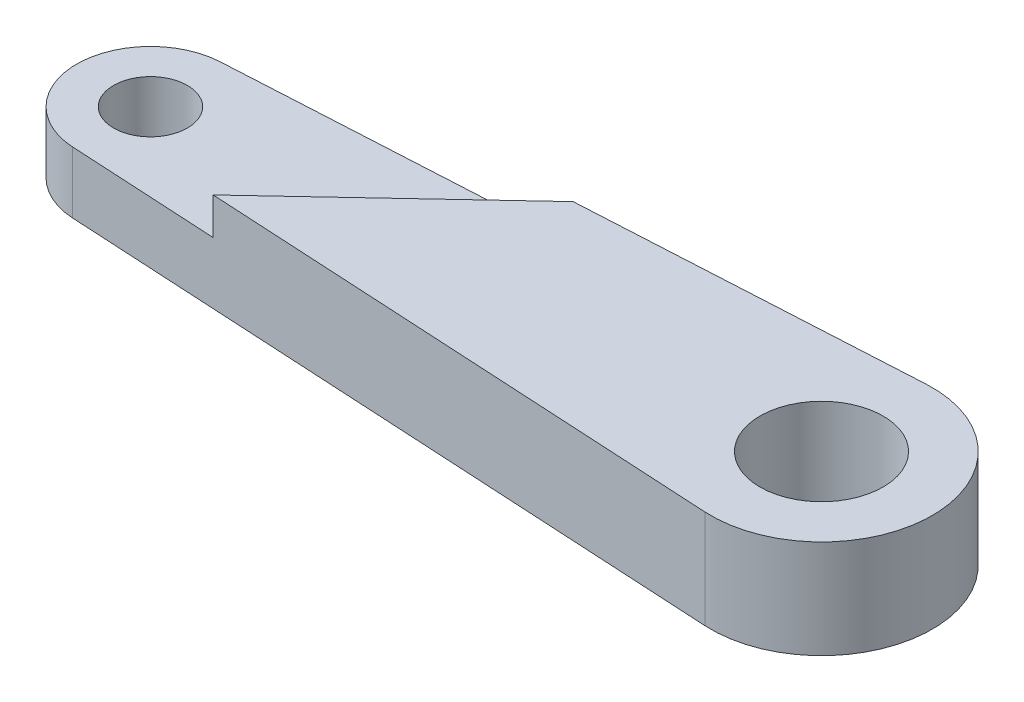
ISO-10303-21;
HEADER;
FILE_DESCRIPTION(('STEP AP214'),'2;1');
FILE_NAME('part.step','',(''),(''),'','','');
FILE_SCHEMA(('AUTOMOTIVE_DESIGN { 1 0 10303 214 1 1 1 1 }'));
ENDSEC;
DATA;
#1=APPLICATION_CONTEXT('core data for automotive mechanical design processes');
#2=APPLICATION_PROTOCOL_DEFINITION('international standard','automotive_design',2000,#1);
#3=PRODUCT_CONTEXT('',#1,'mechanical');
#4=PRODUCT('Part','Part','',(#3));
#5=PRODUCT_RELATED_PRODUCT_CATEGORY('part','',(#4));
#6=PRODUCT_DEFINITION_FORMATION('','',#4);
#7=PRODUCT_DEFINITION_CONTEXT('part definition',#1,'design');
#8=PRODUCT_DEFINITION('design','',#6,#7);
#9=PRODUCT_DEFINITION_SHAPE('','',#8);
#10=(LENGTH_UNIT() NAMED_UNIT(*) SI_UNIT(.MILLI.,.METRE.));
#11=(NAMED_UNIT(*) PLANE_ANGLE_UNIT() SI_UNIT($,.RADIAN.));
#12=(NAMED_UNIT(*) SI_UNIT($,.STERADIAN.) SOLID_ANGLE_UNIT());
#13=UNCERTAINTY_MEASURE_WITH_UNIT(LENGTH_MEASURE(1.E-05),#10,'distance_accuracy_value','');
#14=(GEOMETRIC_REPRESENTATION_CONTEXT(3) GLOBAL_UNCERTAINTY_ASSIGNED_CONTEXT((#13)) GLOBAL_UNIT_ASSIGNED_CONTEXT((#10,
#11,#12)) REPRESENTATION_CONTEXT('',''));
#15=CARTESIAN_POINT('',(0.,0.,0.));
#16=DIRECTION('',(0.,0.,1.));
#17=DIRECTION('',(1.,0.,0.));
#18=AXIS2_PLACEMENT_3D('',#15,#16,#17);
#19=CARTESIAN_POINT('',(0.,4.,0.));
#20=DIRECTION('',(0.,-1.,0.));
#21=DIRECTION('',(0.,0.,-1.));
#22=AXIS2_PLACEMENT_3D('',#19,#20,#21);
#23=CYLINDRICAL_SURFACE('',#22,6.);
#24=CARTESIAN_POINT('',(0.,1.,0.));
#25=DIRECTION('',(0.,1.,0.));
#26=DIRECTION('',(0.,0.,1.));
#27=AXIS2_PLACEMENT_3D('',#24,#25,#26);
#28=CIRCLE('',#27,6.);
#29=CARTESIAN_POINT('',(-0.330275229357798,1.,-5.99090295972758));
#30=VERTEX_POINT('',#29);
#31=CARTESIAN_POINT('',(-0.330275229357798,1.,5.99090295972758));
#32=VERTEX_POINT('',#31);
#33=EDGE_CURVE('E114',#30,#32,#28,.T.);
#34=ORIENTED_EDGE('',*,*,#33,.F.);
#35=DIRECTION('',(0.,-1.,0.));
#36=VECTOR('',#35,1.);
#37=CARTESIAN_POINT('',(-0.330275229357798,4.,-5.99090295972758));
#38=LINE('',#37,#36);
#39=CARTESIAN_POINT('',(-0.330275229357798,-4.,-5.99090295972758));
#40=VERTEX_POINT('',#39);
#41=EDGE_CURVE('E11',#30,#40,#38,.T.);
#42=ORIENTED_EDGE('',*,*,#41,.T.);
#43=CARTESIAN_POINT('',(0.,-4.,0.));
#44=DIRECTION('',(0.,1.,0.));
#45=DIRECTION('',(0.,0.,1.));
#46=AXIS2_PLACEMENT_3D('',#43,#44,#45);
#47=CIRCLE('',#46,6.);
#48=CARTESIAN_POINT('',(-0.330275229357798,-4.,5.99090295972758));
#49=VERTEX_POINT('',#48);
#50=EDGE_CURVE('E109',#40,#49,#47,.T.);
#51=ORIENTED_EDGE('',*,*,#50,.T.);
#52=DIRECTION('',(0.,-1.,0.));
#53=VECTOR('',#52,1.);
#54=CARTESIAN_POINT('',(-0.330275229357798,4.,5.99090295972758));
#55=LINE('',#54,#53);
#56=EDGE_CURVE('E52',#32,#49,#55,.T.);
#57=ORIENTED_EDGE('',*,*,#56,.F.);
#58=EDGE_LOOP('',(#34,#42,#51,#57));
#59=FACE_BOUND('',#58,.T.);
#60=ADVANCED_FACE('F43',(#59),#23,.T.);
#61=CARTESIAN_POINT('',(0.,4.,0.));
#62=DIRECTION('',(0.,-1.,0.));
#63=DIRECTION('',(0.,0.,-1.));
#64=AXIS2_PLACEMENT_3D('',#61,#62,#63);
#65=CYLINDRICAL_SURFACE('',#64,3.);
#66=CARTESIAN_POINT('',(0.,-4.,0.));
#67=DIRECTION('',(0.,1.,0.));
#68=DIRECTION('',(0.,0.,1.));
#69=AXIS2_PLACEMENT_3D('',#66,#67,#68);
#70=CIRCLE('',#69,3.);
#71=CARTESIAN_POINT('',(0.,-4.,3.));
#72=VERTEX_POINT('',#71);
#73=EDGE_CURVE('E122',#72,#72,#70,.T.);
#74=ORIENTED_EDGE('',*,*,#73,.F.);
#75=EDGE_LOOP('',(#74));
#76=FACE_BOUND('',#75,.T.);
#77=CARTESIAN_POINT('',(0.,1.,0.));
#78=DIRECTION('',(0.,1.,0.));
#79=DIRECTION('',(0.,0.,1.));
#80=AXIS2_PLACEMENT_3D('',#77,#78,#79);
#81=CIRCLE('',#80,3.);
#82=CARTESIAN_POINT('',(0.,1.,3.));
#83=VERTEX_POINT('',#82);
#84=EDGE_CURVE('E47',#83,#83,#81,.T.);
#85=ORIENTED_EDGE('',*,*,#84,.T.);
#86=EDGE_LOOP('',(#85));
#87=FACE_BOUND('',#86,.T.);
#88=ADVANCED_FACE('F183',(#76,#87),#65,.F.);
#89=CARTESIAN_POINT('',(-0.330275229357798,4.,-5.99090295972758));
#90=DIRECTION('',(-0.0550458715596329,0.,-0.998483826621263));
#91=DIRECTION('',(-0.998483826621263,0.,0.0550458715596329));
#92=AXIS2_PLACEMENT_3D('',#89,#90,#91);
#93=PLANE('',#92);
#94=DIRECTION('',(0.,1.,0.));
#95=VECTOR('',#94,1.);
#96=CARTESIAN_POINT('',(26.8371559633028,1.,-7.48862869965948));
#97=LINE('',#96,#95);
#98=CARTESIAN_POINT('',(26.8371559633028,1.,-7.48862869965948));
#99=VERTEX_POINT('',#98);
#100=CARTESIAN_POINT('',(26.8371559633028,4.,-7.48862869965948));
#101=VERTEX_POINT('',#100);
#102=EDGE_CURVE('E152',#99,#101,#97,.T.);
#103=ORIENTED_EDGE('',*,*,#102,.T.);
#104=DIRECTION('',(0.998483826621263,0.,-0.0550458715596329));
#105=VECTOR('',#104,1.);
#106=CARTESIAN_POINT('',(-0.330275229357798,4.,-5.99090295972758));
#107=LINE('',#106,#105);
#108=CARTESIAN_POINT('',(54.0045871559633,4.,-8.98635443959137));
#109=VERTEX_POINT('',#108);
#110=EDGE_CURVE('E68',#101,#109,#107,.T.);
#111=ORIENTED_EDGE('',*,*,#110,.T.);
#112=DIRECTION('',(0.,-1.,0.));
#113=VECTOR('',#112,1.);
#114=CARTESIAN_POINT('',(54.0045871559633,4.,-8.98635443959137));
#115=LINE('',#114,#113);
#116=CARTESIAN_POINT('',(54.0045871559633,-4.,-8.98635443959137));
#117=VERTEX_POINT('',#116);
#118=EDGE_CURVE('E85',#109,#117,#115,.T.);
#119=ORIENTED_EDGE('',*,*,#118,.T.);
#120=DIRECTION('',(0.998483826621263,0.,-0.0550458715596329));
#121=VECTOR('',#120,1.);
#122=CARTESIAN_POINT('',(-0.330275229357798,-4.,-5.99090295972758));
#123=LINE('',#122,#121);
#124=EDGE_CURVE('E89',#40,#117,#123,.T.);
#125=ORIENTED_EDGE('',*,*,#124,.F.);
#126=ORIENTED_EDGE('',*,*,#41,.F.);
#127=DIRECTION('',(0.998483826621263,0.,-0.0550458715596329));
#128=VECTOR('',#127,1.);
#129=CARTESIAN_POINT('',(-0.330275229357798,1.,-5.99090295972758));
#130=LINE('',#129,#128);
#131=EDGE_CURVE('E110',#30,#99,#130,.T.);
#132=ORIENTED_EDGE('',*,*,#131,.T.);
#133=EDGE_LOOP('',(#103,#111,#119,#125,#126,#132));
#134=FACE_BOUND('',#133,.T.);
#135=ADVANCED_FACE('F45',(#134),#93,.T.);
#136=CARTESIAN_POINT('',(-0.330275229357798,4.,5.99090295972758));
#137=DIRECTION('',(0.0550458715596329,0.,-0.998483826621263));
#138=DIRECTION('',(-0.998483826621263,0.,-0.0550458715596329));
#139=AXIS2_PLACEMENT_3D('',#136,#137,#138);
#140=PLANE('',#139);
#141=DIRECTION('',(0.998483826621263,0.,0.0550458715596329));
#142=VECTOR('',#141,1.);
#143=CARTESIAN_POINT('',(-0.330275229357798,4.,5.99090295972758));
#144=LINE('',#143,#142);
#145=CARTESIAN_POINT('',(11.7502342028026,4.,6.65689488953965));
#146=VERTEX_POINT('',#145);
#147=CARTESIAN_POINT('',(54.0045871559633,4.,8.98635443959137));
#148=VERTEX_POINT('',#147);
#149=EDGE_CURVE('E155',#146,#148,#144,.T.);
#150=ORIENTED_EDGE('',*,*,#149,.F.);
#151=DIRECTION('',(0.,1.,0.));
#152=VECTOR('',#151,1.);
#153=CARTESIAN_POINT('',(11.7502342028026,1.,6.65689488953965));
#154=LINE('',#153,#152);
#155=CARTESIAN_POINT('',(11.7502342028026,1.,6.65689488953965));
#156=VERTEX_POINT('',#155);
#157=EDGE_CURVE('E59',#156,#146,#154,.T.);
#158=ORIENTED_EDGE('',*,*,#157,.F.);
#159=DIRECTION('',(0.998483826621263,0.,0.0550458715596329));
#160=VECTOR('',#159,1.);
#161=CARTESIAN_POINT('',(-0.330275229357798,1.,5.99090295972758));
#162=LINE('',#161,#160);
#163=EDGE_CURVE('E133',#32,#156,#162,.T.);
#164=ORIENTED_EDGE('',*,*,#163,.F.);
#165=ORIENTED_EDGE('',*,*,#56,.T.);
#166=DIRECTION('',(0.998483826621263,0.,0.0550458715596329));
#167=VECTOR('',#166,1.);
#168=CARTESIAN_POINT('',(-0.330275229357798,-4.,5.99090295972758));
#169=LINE('',#168,#167);
#170=CARTESIAN_POINT('',(54.0045871559633,-4.,8.98635443959137));
#171=VERTEX_POINT('',#170);
#172=EDGE_CURVE('E103',#49,#171,#169,.T.);
#173=ORIENTED_EDGE('',*,*,#172,.T.);
#174=DIRECTION('',(0.,-1.,0.));
#175=VECTOR('',#174,1.);
#176=CARTESIAN_POINT('',(54.0045871559633,4.,8.98635443959137));
#177=LINE('',#176,#175);
#178=EDGE_CURVE('E92',#148,#171,#177,.T.);
#179=ORIENTED_EDGE('',*,*,#178,.F.);
#180=EDGE_LOOP('',(#150,#158,#164,#165,#173,#179));
#181=FACE_BOUND('',#180,.T.);
#182=ADVANCED_FACE('F130',(#181),#140,.F.);
#183=CARTESIAN_POINT('',(54.5,4.,0.));
#184=DIRECTION('',(0.,-1.,0.));
#185=DIRECTION('',(0.,0.,-1.));
#186=AXIS2_PLACEMENT_3D('',#183,#184,#185);
#187=CYLINDRICAL_SURFACE('',#186,5.);
#188=CARTESIAN_POINT('',(54.5,4.,0.));
#189=DIRECTION('',(0.,1.,0.));
#190=DIRECTION('',(0.,0.,1.));
#191=AXIS2_PLACEMENT_3D('',#188,#189,#190);
#192=CIRCLE('',#191,5.);
#193=CARTESIAN_POINT('',(54.5,4.,5.));
#194=VERTEX_POINT('',#193);
#195=EDGE_CURVE('E93',#194,#194,#192,.T.);
#196=ORIENTED_EDGE('',*,*,#195,.T.);
#197=EDGE_LOOP('',(#196));
#198=FACE_BOUND('',#197,.T.);
#199=CARTESIAN_POINT('',(54.5,-4.,0.));
#200=DIRECTION('',(0.,1.,0.));
#201=DIRECTION('',(0.,0.,1.));
#202=AXIS2_PLACEMENT_3D('',#199,#200,#201);
#203=CIRCLE('',#202,5.);
#204=CARTESIAN_POINT('',(54.5,-4.,5.));
#205=VERTEX_POINT('',#204);
#206=EDGE_CURVE('E102',#205,#205,#203,.T.);
#207=ORIENTED_EDGE('',*,*,#206,.F.);
#208=EDGE_LOOP('',(#207));
#209=FACE_BOUND('',#208,.T.);
#210=ADVANCED_FACE('F167',(#198,#209),#187,.F.);
#211=CARTESIAN_POINT('',(54.5,4.,0.));
#212=DIRECTION('',(0.,-1.,0.));
#213=DIRECTION('',(0.,0.,-1.));
#214=AXIS2_PLACEMENT_3D('',#211,#212,#213);
#215=CYLINDRICAL_SURFACE('',#214,9.);
#216=CARTESIAN_POINT('',(54.5,-4.,0.));
#217=DIRECTION('',(0.,1.,0.));
#218=DIRECTION('',(0.,0.,1.));
#219=AXIS2_PLACEMENT_3D('',#216,#217,#218);
#220=CIRCLE('',#219,9.);
#221=EDGE_CURVE('E97',#171,#117,#220,.T.);
#222=ORIENTED_EDGE('',*,*,#221,.T.);
#223=ORIENTED_EDGE('',*,*,#118,.F.);
#224=CARTESIAN_POINT('',(54.5,4.,0.));
#225=DIRECTION('',(0.,1.,0.));
#226=DIRECTION('',(0.,0.,1.));
#227=AXIS2_PLACEMENT_3D('',#224,#225,#226);
#228=CIRCLE('',#227,9.);
#229=EDGE_CURVE('E162',#148,#109,#228,.T.);
#230=ORIENTED_EDGE('',*,*,#229,.F.);
#231=ORIENTED_EDGE('',*,*,#178,.T.);
#232=EDGE_LOOP('',(#222,#223,#230,#231));
#233=FACE_BOUND('',#232,.T.);
#234=ADVANCED_FACE('F98',(#233),#215,.T.);
#235=CARTESIAN_POINT('',(0.,4.,0.));
#236=DIRECTION('',(0.,1.,0.));
#237=DIRECTION('',(0.,0.,1.));
#238=AXIS2_PLACEMENT_3D('',#235,#236,#237);
#239=PLANE('',#238);
#240=DIRECTION('',(0.729500182724467,0.,-0.683980616249444));
#241=VECTOR('',#240,1.);
#242=CARTESIAN_POINT('',(26.8371559633028,4.,-7.48862869965948));
#243=LINE('',#242,#241);
#244=EDGE_CURVE('E153',#146,#101,#243,.T.);
#245=ORIENTED_EDGE('',*,*,#244,.F.);
#246=ORIENTED_EDGE('',*,*,#149,.T.);
#247=ORIENTED_EDGE('',*,*,#229,.T.);
#248=ORIENTED_EDGE('',*,*,#110,.F.);
#249=EDGE_LOOP('',(#245,#246,#247,#248));
#250=FACE_BOUND('',#249,.T.);
#251=ORIENTED_EDGE('',*,*,#195,.F.);
#252=EDGE_LOOP('',(#251));
#253=FACE_BOUND('',#252,.T.);
#254=ADVANCED_FACE('F170',(#250,#253),#239,.T.);
#255=CARTESIAN_POINT('',(0.,-4.,0.));
#256=DIRECTION('',(0.,1.,0.));
#257=DIRECTION('',(0.,0.,1.));
#258=AXIS2_PLACEMENT_3D('',#255,#256,#257);
#259=PLANE('',#258);
#260=ORIENTED_EDGE('',*,*,#124,.T.);
#261=ORIENTED_EDGE('',*,*,#221,.F.);
#262=ORIENTED_EDGE('',*,*,#172,.F.);
#263=ORIENTED_EDGE('',*,*,#50,.F.);
#264=EDGE_LOOP('',(#260,#261,#262,#263));
#265=FACE_BOUND('',#264,.T.);
#266=ORIENTED_EDGE('',*,*,#206,.T.);
#267=EDGE_LOOP('',(#266));
#268=FACE_BOUND('',#267,.T.);
#269=ORIENTED_EDGE('',*,*,#73,.T.);
#270=EDGE_LOOP('',(#269));
#271=FACE_BOUND('',#270,.T.);
#272=ADVANCED_FACE('F106',(#265,#268,#271),#259,.F.);
#273=CARTESIAN_POINT('',(26.8371559633028,1.,-7.48862869965948));
#274=DIRECTION('',(0.683980616249444,0.,0.729500182724467));
#275=DIRECTION('',(0.729500182724467,0.,-0.683980616249444));
#276=AXIS2_PLACEMENT_3D('',#273,#274,#275);
#277=PLANE('',#276);
#278=ORIENTED_EDGE('',*,*,#244,.T.);
#279=ORIENTED_EDGE('',*,*,#102,.F.);
#280=DIRECTION('',(0.729500182724467,0.,-0.683980616249444));
#281=VECTOR('',#280,1.);
#282=CARTESIAN_POINT('',(26.8371559633028,1.,-7.48862869965948));
#283=LINE('',#282,#281);
#284=EDGE_CURVE('E149',#156,#99,#283,.T.);
#285=ORIENTED_EDGE('',*,*,#284,.F.);
#286=ORIENTED_EDGE('',*,*,#157,.T.);
#287=EDGE_LOOP('',(#278,#279,#285,#286));
#288=FACE_BOUND('',#287,.T.);
#289=ADVANCED_FACE('F151',(#288),#277,.F.);
#290=CARTESIAN_POINT('',(0.,1.,0.));
#291=DIRECTION('',(0.,1.,0.));
#292=DIRECTION('',(0.,0.,1.));
#293=AXIS2_PLACEMENT_3D('',#290,#291,#292);
#294=PLANE('',#293);
#295=ORIENTED_EDGE('',*,*,#84,.F.);
#296=EDGE_LOOP('',(#295));
#297=FACE_BOUND('',#296,.T.);
#298=ORIENTED_EDGE('',*,*,#33,.T.);
#299=ORIENTED_EDGE('',*,*,#163,.T.);
#300=ORIENTED_EDGE('',*,*,#284,.T.);
#301=ORIENTED_EDGE('',*,*,#131,.F.);
#302=EDGE_LOOP('',(#298,#299,#300,#301));
#303=FACE_BOUND('',#302,.T.);
#304=ADVANCED_FACE('F148',(#297,#303),#294,.T.);
#305=CLOSED_SHELL('',(#60,#88,#135,#182,#210,#234,#254,#272,#289,#304));
#306=MANIFOLD_SOLID_BREP('B2',#305);
#307=ADVANCED_BREP_SHAPE_REPRESENTATION('',(#18,#306),#14);
#308=SHAPE_DEFINITION_REPRESENTATION(#9,#307);
ENDSEC;
END-ISO-10303-21;
